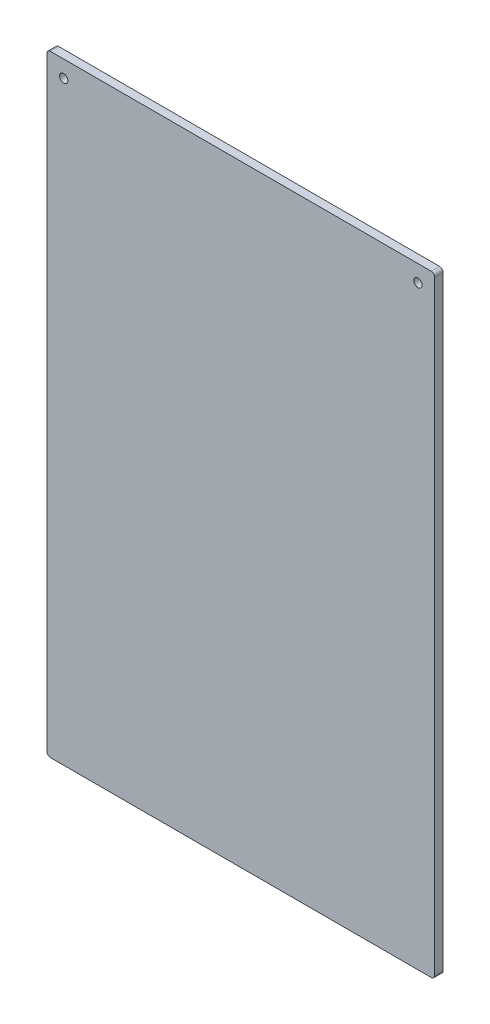
ISO-10303-21;
HEADER;
FILE_DESCRIPTION(('STEP AP214'),'2;1');
FILE_NAME('part.step','',(''),(''),'','','');
FILE_SCHEMA(('AUTOMOTIVE_DESIGN { 1 0 10303 214 1 1 1 1 }'));
ENDSEC;
DATA;
#1=APPLICATION_CONTEXT('core data for automotive mechanical design processes');
#2=APPLICATION_PROTOCOL_DEFINITION('international standard','automotive_design',2000,#1);
#3=PRODUCT_CONTEXT('',#1,'mechanical');
#4=PRODUCT('Part','Part','',(#3));
#5=PRODUCT_RELATED_PRODUCT_CATEGORY('part','',(#4));
#6=PRODUCT_DEFINITION_FORMATION('','',#4);
#7=PRODUCT_DEFINITION_CONTEXT('part definition',#1,'design');
#8=PRODUCT_DEFINITION('design','',#6,#7);
#9=PRODUCT_DEFINITION_SHAPE('','',#8);
#10=(LENGTH_UNIT() NAMED_UNIT(*) SI_UNIT(.MILLI.,.METRE.));
#11=(NAMED_UNIT(*) PLANE_ANGLE_UNIT() SI_UNIT($,.RADIAN.));
#12=(NAMED_UNIT(*) SI_UNIT($,.STERADIAN.) SOLID_ANGLE_UNIT());
#13=UNCERTAINTY_MEASURE_WITH_UNIT(LENGTH_MEASURE(1.E-05),#10,'distance_accuracy_value','');
#14=(GEOMETRIC_REPRESENTATION_CONTEXT(3) GLOBAL_UNCERTAINTY_ASSIGNED_CONTEXT((#13)) GLOBAL_UNIT_ASSIGNED_CONTEXT((#10,
#11,#12)) REPRESENTATION_CONTEXT('',''));
#15=CARTESIAN_POINT('',(0.,0.,0.));
#16=DIRECTION('',(0.,0.,1.));
#17=DIRECTION('',(1.,0.,0.));
#18=AXIS2_PLACEMENT_3D('',#15,#16,#17);
#19=CARTESIAN_POINT('',(0.,0.,6.35));
#20=DIRECTION('',(0.,0.,-1.));
#21=DIRECTION('',(-1.,0.,0.));
#22=AXIS2_PLACEMENT_3D('',#19,#20,#21);
#23=PLANE('',#22);
#24=DIRECTION('',(-1.,0.,0.));
#25=VECTOR('',#24,1.);
#26=CARTESIAN_POINT('',(0.,464.82,6.35));
#27=LINE('',#26,#25);
#28=CARTESIAN_POINT('',(292.1,464.82,6.35));
#29=VERTEX_POINT('',#28);
#30=CARTESIAN_POINT('',(2.53999999999992,464.82,6.35));
#31=VERTEX_POINT('',#30);
#32=EDGE_CURVE('E136',#29,#31,#27,.T.);
#33=ORIENTED_EDGE('',*,*,#32,.T.);
#34=CARTESIAN_POINT('',(2.53999999999992,462.28,6.35));
#35=DIRECTION('',(0.,0.,-1.));
#36=DIRECTION('',(-1.,0.,0.));
#37=AXIS2_PLACEMENT_3D('',#34,#35,#36);
#38=CIRCLE('',#37,2.54);
#39=CARTESIAN_POINT('',(0.,462.28,6.35));
#40=VERTEX_POINT('',#39);
#41=EDGE_CURVE('E155',#31,#40,#38,.F.);
#42=ORIENTED_EDGE('',*,*,#41,.T.);
#43=DIRECTION('',(0.,-1.,0.));
#44=VECTOR('',#43,1.);
#45=CARTESIAN_POINT('',(0.,0.,6.35));
#46=LINE('',#45,#44);
#47=CARTESIAN_POINT('',(0.,2.54,6.35));
#48=VERTEX_POINT('',#47);
#49=EDGE_CURVE('E119',#40,#48,#46,.T.);
#50=ORIENTED_EDGE('',*,*,#49,.T.);
#51=CARTESIAN_POINT('',(2.54,2.54,6.35));
#52=DIRECTION('',(0.,0.,-1.));
#53=DIRECTION('',(-1.,0.,0.));
#54=AXIS2_PLACEMENT_3D('',#51,#52,#53);
#55=CIRCLE('',#54,2.54);
#56=CARTESIAN_POINT('',(2.54,0.,6.35));
#57=VERTEX_POINT('',#56);
#58=EDGE_CURVE('E153',#48,#57,#55,.F.);
#59=ORIENTED_EDGE('',*,*,#58,.T.);
#60=DIRECTION('',(1.,0.,0.));
#61=VECTOR('',#60,1.);
#62=CARTESIAN_POINT('',(0.,0.,6.35));
#63=LINE('',#62,#61);
#64=CARTESIAN_POINT('',(292.1,0.,6.35));
#65=VERTEX_POINT('',#64);
#66=EDGE_CURVE('E166',#57,#65,#63,.T.);
#67=ORIENTED_EDGE('',*,*,#66,.T.);
#68=CARTESIAN_POINT('',(292.1,2.54,6.35));
#69=DIRECTION('',(0.,0.,-1.));
#70=DIRECTION('',(-1.,0.,0.));
#71=AXIS2_PLACEMENT_3D('',#68,#69,#70);
#72=CIRCLE('',#71,2.54);
#73=CARTESIAN_POINT('',(294.64,2.54,6.35));
#74=VERTEX_POINT('',#73);
#75=EDGE_CURVE('E54',#65,#74,#72,.F.);
#76=ORIENTED_EDGE('',*,*,#75,.T.);
#77=DIRECTION('',(0.,1.,0.));
#78=VECTOR('',#77,1.);
#79=CARTESIAN_POINT('',(294.64,0.,6.35));
#80=LINE('',#79,#78);
#81=CARTESIAN_POINT('',(294.64,462.28,6.35));
#82=VERTEX_POINT('',#81);
#83=EDGE_CURVE('E174',#74,#82,#80,.T.);
#84=ORIENTED_EDGE('',*,*,#83,.T.);
#85=CARTESIAN_POINT('',(292.1,462.28,6.35));
#86=DIRECTION('',(0.,0.,-1.));
#87=DIRECTION('',(-1.,0.,0.));
#88=AXIS2_PLACEMENT_3D('',#85,#86,#87);
#89=CIRCLE('',#88,2.54);
#90=EDGE_CURVE('E150',#82,#29,#89,.F.);
#91=ORIENTED_EDGE('',*,*,#90,.T.);
#92=EDGE_LOOP('',(#33,#42,#50,#59,#67,#76,#84,#91));
#93=FACE_BOUND('',#92,.T.);
#94=CARTESIAN_POINT('',(12.6999999999999,452.12,6.35));
#95=DIRECTION('',(0.,0.,1.));
#96=DIRECTION('',(1.,0.,0.));
#97=AXIS2_PLACEMENT_3D('',#94,#95,#96);
#98=CIRCLE('',#97,3.175);
#99=CARTESIAN_POINT('',(15.8749999999999,452.12,6.35));
#100=VERTEX_POINT('',#99);
#101=EDGE_CURVE('E127',#100,#100,#98,.T.);
#102=ORIENTED_EDGE('',*,*,#101,.F.);
#103=EDGE_LOOP('',(#102));
#104=FACE_BOUND('',#103,.T.);
#105=CARTESIAN_POINT('',(281.94,452.12,6.35));
#106=DIRECTION('',(0.,0.,1.));
#107=DIRECTION('',(1.,0.,0.));
#108=AXIS2_PLACEMENT_3D('',#105,#106,#107);
#109=CIRCLE('',#108,3.17499999999997);
#110=CARTESIAN_POINT('',(285.115,452.12,6.35));
#111=VERTEX_POINT('',#110);
#112=EDGE_CURVE('E181',#111,#111,#109,.T.);
#113=ORIENTED_EDGE('',*,*,#112,.F.);
#114=EDGE_LOOP('',(#113));
#115=FACE_BOUND('',#114,.T.);
#116=ADVANCED_FACE('F33',(#93,#104,#115),#23,.F.);
#117=CARTESIAN_POINT('',(0.,0.,0.));
#118=DIRECTION('',(0.,0.,-1.));
#119=DIRECTION('',(-1.,0.,0.));
#120=AXIS2_PLACEMENT_3D('',#117,#118,#119);
#121=PLANE('',#120);
#122=CARTESIAN_POINT('',(12.6999999999999,452.12,0.));
#123=DIRECTION('',(0.,0.,1.));
#124=DIRECTION('',(1.,0.,0.));
#125=AXIS2_PLACEMENT_3D('',#122,#123,#124);
#126=CIRCLE('',#125,3.175);
#127=CARTESIAN_POINT('',(15.8749999999999,452.12,0.));
#128=VERTEX_POINT('',#127);
#129=EDGE_CURVE('E133',#128,#128,#126,.T.);
#130=ORIENTED_EDGE('',*,*,#129,.T.);
#131=EDGE_LOOP('',(#130));
#132=FACE_BOUND('',#131,.T.);
#133=DIRECTION('',(0.,-1.,0.));
#134=VECTOR('',#133,1.);
#135=CARTESIAN_POINT('',(0.,0.,0.));
#136=LINE('',#135,#134);
#137=CARTESIAN_POINT('',(0.,462.28,0.));
#138=VERTEX_POINT('',#137);
#139=CARTESIAN_POINT('',(0.,2.54,0.));
#140=VERTEX_POINT('',#139);
#141=EDGE_CURVE('E116',#138,#140,#136,.T.);
#142=ORIENTED_EDGE('',*,*,#141,.F.);
#143=CARTESIAN_POINT('',(2.53999999999992,462.28,0.));
#144=DIRECTION('',(0.,0.,-1.));
#145=DIRECTION('',(-1.,0.,0.));
#146=AXIS2_PLACEMENT_3D('',#143,#144,#145);
#147=CIRCLE('',#146,2.54);
#148=CARTESIAN_POINT('',(2.53999999999992,464.82,0.));
#149=VERTEX_POINT('',#148);
#150=EDGE_CURVE('E99',#138,#149,#147,.T.);
#151=ORIENTED_EDGE('',*,*,#150,.T.);
#152=DIRECTION('',(-1.,0.,0.));
#153=VECTOR('',#152,1.);
#154=CARTESIAN_POINT('',(0.,464.82,0.));
#155=LINE('',#154,#153);
#156=CARTESIAN_POINT('',(292.1,464.82,0.));
#157=VERTEX_POINT('',#156);
#158=EDGE_CURVE('E140',#157,#149,#155,.T.);
#159=ORIENTED_EDGE('',*,*,#158,.F.);
#160=CARTESIAN_POINT('',(292.1,462.28,0.));
#161=DIRECTION('',(0.,0.,-1.));
#162=DIRECTION('',(-1.,0.,0.));
#163=AXIS2_PLACEMENT_3D('',#160,#161,#162);
#164=CIRCLE('',#163,2.54);
#165=CARTESIAN_POINT('',(294.64,462.28,0.));
#166=VERTEX_POINT('',#165);
#167=EDGE_CURVE('E120',#157,#166,#164,.T.);
#168=ORIENTED_EDGE('',*,*,#167,.T.);
#169=DIRECTION('',(0.,1.,0.));
#170=VECTOR('',#169,1.);
#171=CARTESIAN_POINT('',(294.64,0.,0.));
#172=LINE('',#171,#170);
#173=CARTESIAN_POINT('',(294.64,2.54,0.));
#174=VERTEX_POINT('',#173);
#175=EDGE_CURVE('E130',#174,#166,#172,.T.);
#176=ORIENTED_EDGE('',*,*,#175,.F.);
#177=CARTESIAN_POINT('',(292.1,2.54,0.));
#178=DIRECTION('',(0.,0.,-1.));
#179=DIRECTION('',(-1.,0.,0.));
#180=AXIS2_PLACEMENT_3D('',#177,#178,#179);
#181=CIRCLE('',#180,2.54);
#182=CARTESIAN_POINT('',(292.1,0.,0.));
#183=VERTEX_POINT('',#182);
#184=EDGE_CURVE('E144',#174,#183,#181,.T.);
#185=ORIENTED_EDGE('',*,*,#184,.T.);
#186=DIRECTION('',(1.,0.,0.));
#187=VECTOR('',#186,1.);
#188=CARTESIAN_POINT('',(0.,0.,0.));
#189=LINE('',#188,#187);
#190=CARTESIAN_POINT('',(2.54,0.,0.));
#191=VERTEX_POINT('',#190);
#192=EDGE_CURVE('E126',#191,#183,#189,.T.);
#193=ORIENTED_EDGE('',*,*,#192,.F.);
#194=CARTESIAN_POINT('',(2.54,2.54,0.));
#195=DIRECTION('',(0.,0.,-1.));
#196=DIRECTION('',(-1.,0.,0.));
#197=AXIS2_PLACEMENT_3D('',#194,#195,#196);
#198=CIRCLE('',#197,2.54);
#199=EDGE_CURVE('E110',#191,#140,#198,.T.);
#200=ORIENTED_EDGE('',*,*,#199,.T.);
#201=EDGE_LOOP('',(#142,#151,#159,#168,#176,#185,#193,#200));
#202=FACE_BOUND('',#201,.T.);
#203=CARTESIAN_POINT('',(281.94,452.12,0.));
#204=DIRECTION('',(0.,0.,1.));
#205=DIRECTION('',(1.,0.,0.));
#206=AXIS2_PLACEMENT_3D('',#203,#204,#205);
#207=CIRCLE('',#206,3.17499999999997);
#208=CARTESIAN_POINT('',(285.115,452.12,0.));
#209=VERTEX_POINT('',#208);
#210=EDGE_CURVE('E183',#209,#209,#207,.T.);
#211=ORIENTED_EDGE('',*,*,#210,.T.);
#212=EDGE_LOOP('',(#211));
#213=FACE_BOUND('',#212,.T.);
#214=ADVANCED_FACE('F123',(#132,#202,#213),#121,.T.);
#215=CARTESIAN_POINT('',(0.,0.,6.35));
#216=DIRECTION('',(1.,0.,0.));
#217=DIRECTION('',(0.,1.,0.));
#218=AXIS2_PLACEMENT_3D('',#215,#216,#217);
#219=PLANE('',#218);
#220=ORIENTED_EDGE('',*,*,#49,.F.);
#221=DIRECTION('',(0.,0.,-1.));
#222=VECTOR('',#221,1.);
#223=CARTESIAN_POINT('',(0.,462.28,6.35));
#224=LINE('',#223,#222);
#225=EDGE_CURVE('E103',#40,#138,#224,.T.);
#226=ORIENTED_EDGE('',*,*,#225,.T.);
#227=ORIENTED_EDGE('',*,*,#141,.T.);
#228=DIRECTION('',(0.,0.,-1.));
#229=VECTOR('',#228,1.);
#230=CARTESIAN_POINT('',(0.,2.54,6.35));
#231=LINE('',#230,#229);
#232=EDGE_CURVE('E121',#140,#48,#231,.F.);
#233=ORIENTED_EDGE('',*,*,#232,.T.);
#234=EDGE_LOOP('',(#220,#226,#227,#233));
#235=FACE_BOUND('',#234,.T.);
#236=ADVANCED_FACE('F115',(#235),#219,.F.);
#237=CARTESIAN_POINT('',(0.,0.,6.35));
#238=DIRECTION('',(0.,1.,0.));
#239=DIRECTION('',(0.,0.,1.));
#240=AXIS2_PLACEMENT_3D('',#237,#238,#239);
#241=PLANE('',#240);
#242=ORIENTED_EDGE('',*,*,#66,.F.);
#243=DIRECTION('',(0.,0.,-1.));
#244=VECTOR('',#243,1.);
#245=CARTESIAN_POINT('',(2.54,0.,6.35));
#246=LINE('',#245,#244);
#247=EDGE_CURVE('E159',#57,#191,#246,.T.);
#248=ORIENTED_EDGE('',*,*,#247,.T.);
#249=ORIENTED_EDGE('',*,*,#192,.T.);
#250=DIRECTION('',(0.,0.,-1.));
#251=VECTOR('',#250,1.);
#252=CARTESIAN_POINT('',(292.1,0.,6.35));
#253=LINE('',#252,#251);
#254=EDGE_CURVE('E157',#183,#65,#253,.F.);
#255=ORIENTED_EDGE('',*,*,#254,.T.);
#256=EDGE_LOOP('',(#242,#248,#249,#255));
#257=FACE_BOUND('',#256,.T.);
#258=ADVANCED_FACE('F164',(#257),#241,.F.);
#259=CARTESIAN_POINT('',(294.64,0.,6.35));
#260=DIRECTION('',(-1.,0.,0.));
#261=DIRECTION('',(0.,-1.,0.));
#262=AXIS2_PLACEMENT_3D('',#259,#260,#261);
#263=PLANE('',#262);
#264=ORIENTED_EDGE('',*,*,#83,.F.);
#265=DIRECTION('',(0.,0.,-1.));
#266=VECTOR('',#265,1.);
#267=CARTESIAN_POINT('',(294.64,2.54,6.35));
#268=LINE('',#267,#266);
#269=EDGE_CURVE('E11',#74,#174,#268,.T.);
#270=ORIENTED_EDGE('',*,*,#269,.T.);
#271=ORIENTED_EDGE('',*,*,#175,.T.);
#272=DIRECTION('',(0.,0.,-1.));
#273=VECTOR('',#272,1.);
#274=CARTESIAN_POINT('',(294.64,462.28,6.35));
#275=LINE('',#274,#273);
#276=EDGE_CURVE('E41',#166,#82,#275,.F.);
#277=ORIENTED_EDGE('',*,*,#276,.T.);
#278=EDGE_LOOP('',(#264,#270,#271,#277));
#279=FACE_BOUND('',#278,.T.);
#280=ADVANCED_FACE('F173',(#279),#263,.F.);
#281=CARTESIAN_POINT('',(0.,464.82,6.35));
#282=DIRECTION('',(0.,-1.,0.));
#283=DIRECTION('',(0.,0.,-1.));
#284=AXIS2_PLACEMENT_3D('',#281,#282,#283);
#285=PLANE('',#284);
#286=ORIENTED_EDGE('',*,*,#158,.T.);
#287=DIRECTION('',(0.,0.,-1.));
#288=VECTOR('',#287,1.);
#289=CARTESIAN_POINT('',(2.53999999999992,464.82,6.35));
#290=LINE('',#289,#288);
#291=EDGE_CURVE('E104',#149,#31,#290,.F.);
#292=ORIENTED_EDGE('',*,*,#291,.T.);
#293=ORIENTED_EDGE('',*,*,#32,.F.);
#294=DIRECTION('',(0.,0.,-1.));
#295=VECTOR('',#294,1.);
#296=CARTESIAN_POINT('',(292.1,464.82,6.35));
#297=LINE('',#296,#295);
#298=EDGE_CURVE('E109',#29,#157,#297,.T.);
#299=ORIENTED_EDGE('',*,*,#298,.T.);
#300=EDGE_LOOP('',(#286,#292,#293,#299));
#301=FACE_BOUND('',#300,.T.);
#302=ADVANCED_FACE('F204',(#301),#285,.F.);
#303=CARTESIAN_POINT('',(12.6999999999999,452.12,6.35));
#304=DIRECTION('',(0.,0.,-1.));
#305=DIRECTION('',(-1.,0.,0.));
#306=AXIS2_PLACEMENT_3D('',#303,#304,#305);
#307=CYLINDRICAL_SURFACE('',#306,3.175);
#308=ORIENTED_EDGE('',*,*,#101,.T.);
#309=EDGE_LOOP('',(#308));
#310=FACE_BOUND('',#309,.T.);
#311=ORIENTED_EDGE('',*,*,#129,.F.);
#312=EDGE_LOOP('',(#311));
#313=FACE_BOUND('',#312,.T.);
#314=ADVANCED_FACE('F201',(#310,#313),#307,.F.);
#315=CARTESIAN_POINT('',(281.94,452.12,6.35));
#316=DIRECTION('',(0.,0.,-1.));
#317=DIRECTION('',(-1.,0.,0.));
#318=AXIS2_PLACEMENT_3D('',#315,#316,#317);
#319=CYLINDRICAL_SURFACE('',#318,3.17499999999997);
#320=ORIENTED_EDGE('',*,*,#112,.T.);
#321=EDGE_LOOP('',(#320));
#322=FACE_BOUND('',#321,.T.);
#323=ORIENTED_EDGE('',*,*,#210,.F.);
#324=EDGE_LOOP('',(#323));
#325=FACE_BOUND('',#324,.T.);
#326=ADVANCED_FACE('F189',(#322,#325),#319,.F.);
#327=CARTESIAN_POINT('',(2.53999999999992,462.28,6.35));
#328=DIRECTION('',(0.,0.,-1.));
#329=DIRECTION('',(-1.,0.,0.));
#330=AXIS2_PLACEMENT_3D('',#327,#328,#329);
#331=CYLINDRICAL_SURFACE('',#330,2.54);
#332=ORIENTED_EDGE('',*,*,#41,.F.);
#333=ORIENTED_EDGE('',*,*,#291,.F.);
#334=ORIENTED_EDGE('',*,*,#150,.F.);
#335=ORIENTED_EDGE('',*,*,#225,.F.);
#336=EDGE_LOOP('',(#332,#333,#334,#335));
#337=FACE_BOUND('',#336,.T.);
#338=ADVANCED_FACE('F102',(#337),#331,.T.);
#339=CARTESIAN_POINT('',(2.54,2.54,6.35));
#340=DIRECTION('',(0.,0.,-1.));
#341=DIRECTION('',(-1.,0.,0.));
#342=AXIS2_PLACEMENT_3D('',#339,#340,#341);
#343=CYLINDRICAL_SURFACE('',#342,2.54);
#344=ORIENTED_EDGE('',*,*,#58,.F.);
#345=ORIENTED_EDGE('',*,*,#232,.F.);
#346=ORIENTED_EDGE('',*,*,#199,.F.);
#347=ORIENTED_EDGE('',*,*,#247,.F.);
#348=EDGE_LOOP('',(#344,#345,#346,#347));
#349=FACE_BOUND('',#348,.T.);
#350=ADVANCED_FACE('F216',(#349),#343,.T.);
#351=CARTESIAN_POINT('',(292.1,2.54,6.35));
#352=DIRECTION('',(0.,0.,-1.));
#353=DIRECTION('',(-1.,0.,0.));
#354=AXIS2_PLACEMENT_3D('',#351,#352,#353);
#355=CYLINDRICAL_SURFACE('',#354,2.54);
#356=ORIENTED_EDGE('',*,*,#75,.F.);
#357=ORIENTED_EDGE('',*,*,#254,.F.);
#358=ORIENTED_EDGE('',*,*,#184,.F.);
#359=ORIENTED_EDGE('',*,*,#269,.F.);
#360=EDGE_LOOP('',(#356,#357,#358,#359));
#361=FACE_BOUND('',#360,.T.);
#362=ADVANCED_FACE('F172',(#361),#355,.T.);
#363=CARTESIAN_POINT('',(292.1,462.28,6.35));
#364=DIRECTION('',(0.,0.,-1.));
#365=DIRECTION('',(-1.,0.,0.));
#366=AXIS2_PLACEMENT_3D('',#363,#364,#365);
#367=CYLINDRICAL_SURFACE('',#366,2.54);
#368=ORIENTED_EDGE('',*,*,#90,.F.);
#369=ORIENTED_EDGE('',*,*,#276,.F.);
#370=ORIENTED_EDGE('',*,*,#167,.F.);
#371=ORIENTED_EDGE('',*,*,#298,.F.);
#372=EDGE_LOOP('',(#368,#369,#370,#371));
#373=FACE_BOUND('',#372,.T.);
#374=ADVANCED_FACE('F35',(#373),#367,.T.);
#375=CLOSED_SHELL('',(#116,#214,#236,#258,#280,#302,#314,#326,#338,#350,#362,#374));
#376=MANIFOLD_SOLID_BREP('B2',#375);
#377=ADVANCED_BREP_SHAPE_REPRESENTATION('',(#18,#376),#14);
#378=SHAPE_DEFINITION_REPRESENTATION(#9,#377);
ENDSEC;
END-ISO-10303-21;
